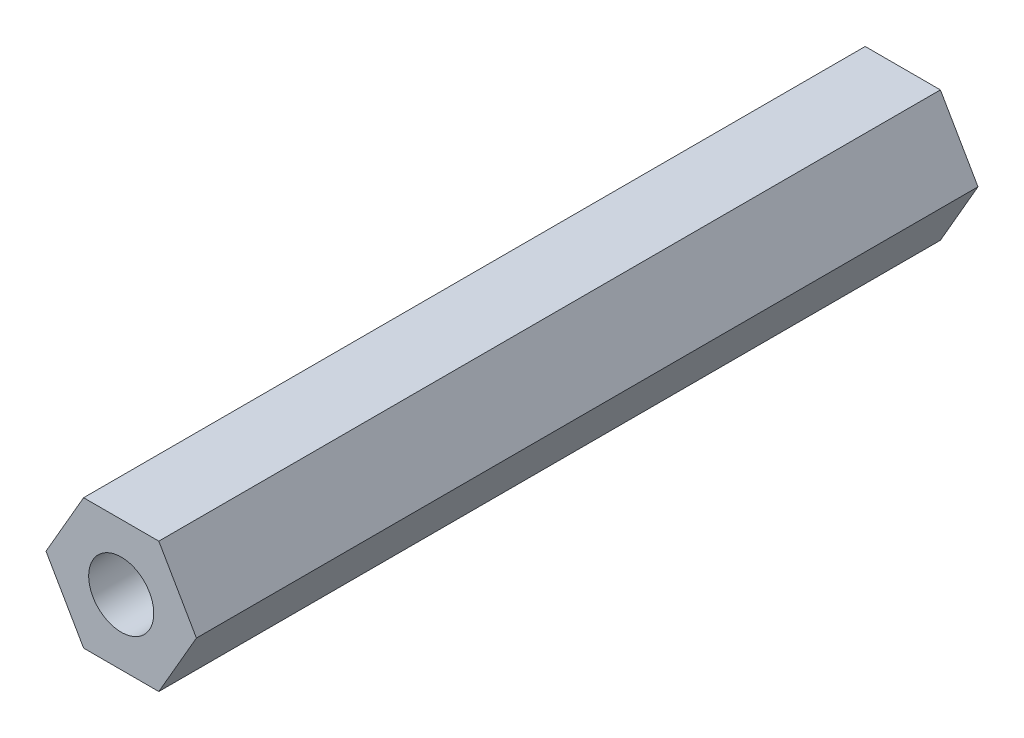
ISO-10303-21;
HEADER;
FILE_DESCRIPTION(('STEP AP214'),'2;1');
FILE_NAME('part.step','',(''),(''),'','','');
FILE_SCHEMA(('AUTOMOTIVE_DESIGN { 1 0 10303 214 1 1 1 1 }'));
ENDSEC;
DATA;
#1=APPLICATION_CONTEXT('core data for automotive mechanical design processes');
#2=APPLICATION_PROTOCOL_DEFINITION('international standard','automotive_design',2000,#1);
#3=PRODUCT_CONTEXT('',#1,'mechanical');
#4=PRODUCT('Part','Part','',(#3));
#5=PRODUCT_RELATED_PRODUCT_CATEGORY('part','',(#4));
#6=PRODUCT_DEFINITION_FORMATION('','',#4);
#7=PRODUCT_DEFINITION_CONTEXT('part definition',#1,'design');
#8=PRODUCT_DEFINITION('design','',#6,#7);
#9=PRODUCT_DEFINITION_SHAPE('','',#8);
#10=(LENGTH_UNIT() NAMED_UNIT(*) SI_UNIT(.MILLI.,.METRE.));
#11=(NAMED_UNIT(*) PLANE_ANGLE_UNIT() SI_UNIT($,.RADIAN.));
#12=(NAMED_UNIT(*) SI_UNIT($,.STERADIAN.) SOLID_ANGLE_UNIT());
#13=UNCERTAINTY_MEASURE_WITH_UNIT(LENGTH_MEASURE(1.E-05),#10,'distance_accuracy_value','');
#14=(GEOMETRIC_REPRESENTATION_CONTEXT(3) GLOBAL_UNCERTAINTY_ASSIGNED_CONTEXT((#13)) GLOBAL_UNIT_ASSIGNED_CONTEXT((#10,
#11,#12)) REPRESENTATION_CONTEXT('',''));
#15=CARTESIAN_POINT('',(0.,0.,0.));
#16=DIRECTION('',(0.,0.,1.));
#17=DIRECTION('',(1.,0.,0.));
#18=AXIS2_PLACEMENT_3D('',#15,#16,#17);
#19=CARTESIAN_POINT('',(0.,0.,76.2));
#20=DIRECTION('',(0.,0.,1.));
#21=DIRECTION('',(1.,0.,0.));
#22=AXIS2_PLACEMENT_3D('',#19,#20,#21);
#23=PLANE('',#22);
#24=DIRECTION('',(-0.5,0.866025403784439,0.));
#25=VECTOR('',#24,1.);
#26=CARTESIAN_POINT('',(7.33234841870825,0.,76.2));
#27=LINE('',#26,#25);
#28=CARTESIAN_POINT('',(7.33234841870825,0.,76.2));
#29=VERTEX_POINT('',#28);
#30=CARTESIAN_POINT('',(3.66617420935413,6.35,76.2));
#31=VERTEX_POINT('',#30);
#32=EDGE_CURVE('E146',#29,#31,#27,.T.);
#33=ORIENTED_EDGE('',*,*,#32,.T.);
#34=DIRECTION('',(-1.,0.,0.));
#35=VECTOR('',#34,1.);
#36=CARTESIAN_POINT('',(3.66617420935413,6.35,76.2));
#37=LINE('',#36,#35);
#38=CARTESIAN_POINT('',(-3.66617420935412,6.35,76.2));
#39=VERTEX_POINT('',#38);
#40=EDGE_CURVE('E94',#31,#39,#37,.T.);
#41=ORIENTED_EDGE('',*,*,#40,.T.);
#42=DIRECTION('',(-0.5,-0.866025403784438,0.));
#43=VECTOR('',#42,1.);
#44=CARTESIAN_POINT('',(-3.66617420935412,6.35,76.2));
#45=LINE('',#44,#43);
#46=CARTESIAN_POINT('',(-7.33234841870825,0.,76.2));
#47=VERTEX_POINT('',#46);
#48=EDGE_CURVE('E107',#39,#47,#45,.T.);
#49=ORIENTED_EDGE('',*,*,#48,.T.);
#50=DIRECTION('',(0.5,-0.866025403784439,0.));
#51=VECTOR('',#50,1.);
#52=CARTESIAN_POINT('',(-7.33234841870825,0.,76.2));
#53=LINE('',#52,#51);
#54=CARTESIAN_POINT('',(-3.66617420935413,-6.35,76.2));
#55=VERTEX_POINT('',#54);
#56=EDGE_CURVE('E101',#47,#55,#53,.T.);
#57=ORIENTED_EDGE('',*,*,#56,.T.);
#58=DIRECTION('',(1.,0.,0.));
#59=VECTOR('',#58,1.);
#60=CARTESIAN_POINT('',(-3.66617420935413,-6.35,76.2));
#61=LINE('',#60,#59);
#62=CARTESIAN_POINT('',(3.66617420935412,-6.35,76.2));
#63=VERTEX_POINT('',#62);
#64=EDGE_CURVE('E105',#55,#63,#61,.T.);
#65=ORIENTED_EDGE('',*,*,#64,.T.);
#66=DIRECTION('',(0.5,0.866025403784438,0.));
#67=VECTOR('',#66,1.);
#68=CARTESIAN_POINT('',(3.66617420935412,-6.35,76.2));
#69=LINE('',#68,#67);
#70=EDGE_CURVE('E57',#63,#29,#69,.T.);
#71=ORIENTED_EDGE('',*,*,#70,.T.);
#72=EDGE_LOOP('',(#33,#41,#49,#57,#65,#71));
#73=FACE_BOUND('',#72,.T.);
#74=CARTESIAN_POINT('',(0.,0.,76.2));
#75=DIRECTION('',(0.,0.,1.));
#76=DIRECTION('',(1.,0.,0.));
#77=AXIS2_PLACEMENT_3D('',#74,#75,#76);
#78=CIRCLE('',#77,3.175);
#79=CARTESIAN_POINT('',(-3.175,0.,76.2));
#80=VERTEX_POINT('',#79);
#81=EDGE_CURVE('E134',#80,#80,#78,.T.);
#82=ORIENTED_EDGE('',*,*,#81,.F.);
#83=EDGE_LOOP('',(#82));
#84=FACE_BOUND('',#83,.T.);
#85=ADVANCED_FACE('F39',(#73,#84),#23,.T.);
#86=CARTESIAN_POINT('',(0.,0.,0.));
#87=DIRECTION('',(0.,0.,1.));
#88=DIRECTION('',(1.,0.,0.));
#89=AXIS2_PLACEMENT_3D('',#86,#87,#88);
#90=PLANE('',#89);
#91=DIRECTION('',(-0.5,0.866025403784439,0.));
#92=VECTOR('',#91,1.);
#93=CARTESIAN_POINT('',(7.33234841870825,0.,0.));
#94=LINE('',#93,#92);
#95=CARTESIAN_POINT('',(7.33234841870825,0.,0.));
#96=VERTEX_POINT('',#95);
#97=CARTESIAN_POINT('',(3.66617420935413,6.35,0.));
#98=VERTEX_POINT('',#97);
#99=EDGE_CURVE('E129',#96,#98,#94,.T.);
#100=ORIENTED_EDGE('',*,*,#99,.F.);
#101=DIRECTION('',(0.5,0.866025403784438,0.));
#102=VECTOR('',#101,1.);
#103=CARTESIAN_POINT('',(3.66617420935412,-6.35,0.));
#104=LINE('',#103,#102);
#105=CARTESIAN_POINT('',(3.66617420935412,-6.35,0.));
#106=VERTEX_POINT('',#105);
#107=EDGE_CURVE('E86',#106,#96,#104,.T.);
#108=ORIENTED_EDGE('',*,*,#107,.F.);
#109=DIRECTION('',(1.,0.,0.));
#110=VECTOR('',#109,1.);
#111=CARTESIAN_POINT('',(-3.66617420935413,-6.35,0.));
#112=LINE('',#111,#110);
#113=CARTESIAN_POINT('',(-3.66617420935413,-6.35,0.));
#114=VERTEX_POINT('',#113);
#115=EDGE_CURVE('E80',#114,#106,#112,.T.);
#116=ORIENTED_EDGE('',*,*,#115,.F.);
#117=DIRECTION('',(0.5,-0.866025403784439,0.));
#118=VECTOR('',#117,1.);
#119=CARTESIAN_POINT('',(-7.33234841870825,0.,0.));
#120=LINE('',#119,#118);
#121=CARTESIAN_POINT('',(-7.33234841870825,0.,0.));
#122=VERTEX_POINT('',#121);
#123=EDGE_CURVE('E116',#122,#114,#120,.T.);
#124=ORIENTED_EDGE('',*,*,#123,.F.);
#125=DIRECTION('',(-0.5,-0.866025403784438,0.));
#126=VECTOR('',#125,1.);
#127=CARTESIAN_POINT('',(-3.66617420935412,6.35,0.));
#128=LINE('',#127,#126);
#129=CARTESIAN_POINT('',(-3.66617420935412,6.35,0.));
#130=VERTEX_POINT('',#129);
#131=EDGE_CURVE('E137',#130,#122,#128,.T.);
#132=ORIENTED_EDGE('',*,*,#131,.F.);
#133=DIRECTION('',(-1.,0.,0.));
#134=VECTOR('',#133,1.);
#135=CARTESIAN_POINT('',(3.66617420935413,6.35,0.));
#136=LINE('',#135,#134);
#137=EDGE_CURVE('E133',#98,#130,#136,.T.);
#138=ORIENTED_EDGE('',*,*,#137,.F.);
#139=EDGE_LOOP('',(#100,#108,#116,#124,#132,#138));
#140=FACE_BOUND('',#139,.T.);
#141=CARTESIAN_POINT('',(0.,0.,0.));
#142=DIRECTION('',(0.,0.,1.));
#143=DIRECTION('',(1.,0.,0.));
#144=AXIS2_PLACEMENT_3D('',#141,#142,#143);
#145=CIRCLE('',#144,3.175);
#146=CARTESIAN_POINT('',(-3.175,0.,0.));
#147=VERTEX_POINT('',#146);
#148=EDGE_CURVE('E243',#147,#147,#145,.T.);
#149=ORIENTED_EDGE('',*,*,#148,.T.);
#150=EDGE_LOOP('',(#149));
#151=FACE_BOUND('',#150,.T.);
#152=ADVANCED_FACE('F159',(#140,#151),#90,.F.);
#153=CARTESIAN_POINT('',(7.33234841870825,0.,76.2));
#154=DIRECTION('',(-0.866025403784439,-0.5,0.));
#155=DIRECTION('',(0.5,-0.866025403784439,0.));
#156=AXIS2_PLACEMENT_3D('',#153,#154,#155);
#157=PLANE('',#156);
#158=ORIENTED_EDGE('',*,*,#99,.T.);
#159=DIRECTION('',(0.,0.,-1.));
#160=VECTOR('',#159,1.);
#161=CARTESIAN_POINT('',(3.66617420935413,6.35,76.2));
#162=LINE('',#161,#160);
#163=EDGE_CURVE('E11',#31,#98,#162,.T.);
#164=ORIENTED_EDGE('',*,*,#163,.F.);
#165=ORIENTED_EDGE('',*,*,#32,.F.);
#166=DIRECTION('',(0.,0.,-1.));
#167=VECTOR('',#166,1.);
#168=CARTESIAN_POINT('',(7.33234841870825,0.,76.2));
#169=LINE('',#168,#167);
#170=EDGE_CURVE('E125',#29,#96,#169,.T.);
#171=ORIENTED_EDGE('',*,*,#170,.T.);
#172=EDGE_LOOP('',(#158,#164,#165,#171));
#173=FACE_BOUND('',#172,.T.);
#174=ADVANCED_FACE('F41',(#173),#157,.F.);
#175=CARTESIAN_POINT('',(3.66617420935413,6.35,76.2));
#176=DIRECTION('',(0.,-1.,0.));
#177=DIRECTION('',(1.,0.,0.));
#178=AXIS2_PLACEMENT_3D('',#175,#176,#177);
#179=PLANE('',#178);
#180=ORIENTED_EDGE('',*,*,#137,.T.);
#181=DIRECTION('',(0.,0.,-1.));
#182=VECTOR('',#181,1.);
#183=CARTESIAN_POINT('',(-3.66617420935412,6.35,76.2));
#184=LINE('',#183,#182);
#185=EDGE_CURVE('E49',#39,#130,#184,.T.);
#186=ORIENTED_EDGE('',*,*,#185,.F.);
#187=ORIENTED_EDGE('',*,*,#40,.F.);
#188=ORIENTED_EDGE('',*,*,#163,.T.);
#189=EDGE_LOOP('',(#180,#186,#187,#188));
#190=FACE_BOUND('',#189,.T.);
#191=ADVANCED_FACE('F184',(#190),#179,.F.);
#192=CARTESIAN_POINT('',(-3.66617420935412,6.35,76.2));
#193=DIRECTION('',(0.866025403784439,-0.5,0.));
#194=DIRECTION('',(0.5,0.866025403784438,0.));
#195=AXIS2_PLACEMENT_3D('',#192,#193,#194);
#196=PLANE('',#195);
#197=ORIENTED_EDGE('',*,*,#131,.T.);
#198=DIRECTION('',(0.,0.,-1.));
#199=VECTOR('',#198,1.);
#200=CARTESIAN_POINT('',(-7.33234841870825,0.,76.2));
#201=LINE('',#200,#199);
#202=EDGE_CURVE('E118',#47,#122,#201,.T.);
#203=ORIENTED_EDGE('',*,*,#202,.F.);
#204=ORIENTED_EDGE('',*,*,#48,.F.);
#205=ORIENTED_EDGE('',*,*,#185,.T.);
#206=EDGE_LOOP('',(#197,#203,#204,#205));
#207=FACE_BOUND('',#206,.T.);
#208=ADVANCED_FACE('F156',(#207),#196,.F.);
#209=CARTESIAN_POINT('',(-7.33234841870825,0.,76.2));
#210=DIRECTION('',(0.866025403784439,0.5,0.));
#211=DIRECTION('',(-0.5,0.866025403784439,0.));
#212=AXIS2_PLACEMENT_3D('',#209,#210,#211);
#213=PLANE('',#212);
#214=ORIENTED_EDGE('',*,*,#123,.T.);
#215=DIRECTION('',(0.,0.,-1.));
#216=VECTOR('',#215,1.);
#217=CARTESIAN_POINT('',(-3.66617420935413,-6.35,76.2));
#218=LINE('',#217,#216);
#219=EDGE_CURVE('E113',#55,#114,#218,.T.);
#220=ORIENTED_EDGE('',*,*,#219,.F.);
#221=ORIENTED_EDGE('',*,*,#56,.F.);
#222=ORIENTED_EDGE('',*,*,#202,.T.);
#223=EDGE_LOOP('',(#214,#220,#221,#222));
#224=FACE_BOUND('',#223,.T.);
#225=ADVANCED_FACE('F114',(#224),#213,.F.);
#226=CARTESIAN_POINT('',(-3.66617420935413,-6.35,76.2));
#227=DIRECTION('',(0.,1.,0.));
#228=DIRECTION('',(-1.,0.,0.));
#229=AXIS2_PLACEMENT_3D('',#226,#227,#228);
#230=PLANE('',#229);
#231=ORIENTED_EDGE('',*,*,#115,.T.);
#232=DIRECTION('',(0.,0.,-1.));
#233=VECTOR('',#232,1.);
#234=CARTESIAN_POINT('',(3.66617420935412,-6.35,76.2));
#235=LINE('',#234,#233);
#236=EDGE_CURVE('E119',#63,#106,#235,.T.);
#237=ORIENTED_EDGE('',*,*,#236,.F.);
#238=ORIENTED_EDGE('',*,*,#64,.F.);
#239=ORIENTED_EDGE('',*,*,#219,.T.);
#240=EDGE_LOOP('',(#231,#237,#238,#239));
#241=FACE_BOUND('',#240,.T.);
#242=ADVANCED_FACE('F121',(#241),#230,.F.);
#243=CARTESIAN_POINT('',(3.66617420935412,-6.35,76.2));
#244=DIRECTION('',(-0.866025403784438,0.5,0.));
#245=DIRECTION('',(-0.5,-0.866025403784438,0.));
#246=AXIS2_PLACEMENT_3D('',#243,#244,#245);
#247=PLANE('',#246);
#248=ORIENTED_EDGE('',*,*,#107,.T.);
#249=ORIENTED_EDGE('',*,*,#170,.F.);
#250=ORIENTED_EDGE('',*,*,#70,.F.);
#251=ORIENTED_EDGE('',*,*,#236,.T.);
#252=EDGE_LOOP('',(#248,#249,#250,#251));
#253=FACE_BOUND('',#252,.T.);
#254=ADVANCED_FACE('F164',(#253),#247,.F.);
#255=CARTESIAN_POINT('',(0.,0.,76.2));
#256=DIRECTION('',(0.,0.,-1.));
#257=DIRECTION('',(-1.,0.,0.));
#258=AXIS2_PLACEMENT_3D('',#255,#256,#257);
#259=CYLINDRICAL_SURFACE('',#258,3.175);
#260=CARTESIAN_POINT('',(-3.175,0.,76.2));
#261=CARTESIAN_POINT('',(-3.175,0.,75.40625));
#262=CARTESIAN_POINT('',(-3.175,0.,74.6125));
#263=CARTESIAN_POINT('',(-3.175,0.,73.025));
#264=CARTESIAN_POINT('',(-3.175,0.,72.23125));
#265=CARTESIAN_POINT('',(-3.175,0.,70.64375));
#266=CARTESIAN_POINT('',(-3.175,0.,69.85));
#267=CARTESIAN_POINT('',(-3.175,0.,68.2625));
#268=CARTESIAN_POINT('',(-3.175,0.,67.46875));
#269=CARTESIAN_POINT('',(-3.175,0.,65.88125));
#270=CARTESIAN_POINT('',(-3.175,0.,65.0875));
#271=CARTESIAN_POINT('',(-3.175,0.,63.5));
#272=CARTESIAN_POINT('',(-3.175,0.,62.70625));
#273=CARTESIAN_POINT('',(-3.175,0.,61.11875));
#274=CARTESIAN_POINT('',(-3.175,0.,60.325));
#275=CARTESIAN_POINT('',(-3.175,0.,58.7375));
#276=CARTESIAN_POINT('',(-3.175,0.,57.94375));
#277=CARTESIAN_POINT('',(-3.175,0.,56.35625));
#278=CARTESIAN_POINT('',(-3.175,0.,55.5625));
#279=CARTESIAN_POINT('',(-3.175,0.,53.975));
#280=CARTESIAN_POINT('',(-3.175,0.,53.18125));
#281=CARTESIAN_POINT('',(-3.175,0.,51.59375));
#282=CARTESIAN_POINT('',(-3.175,0.,50.8));
#283=CARTESIAN_POINT('',(-3.175,0.,49.2125));
#284=CARTESIAN_POINT('',(-3.175,0.,48.41875));
#285=CARTESIAN_POINT('',(-3.175,0.,46.83125));
#286=CARTESIAN_POINT('',(-3.175,0.,46.0375));
#287=CARTESIAN_POINT('',(-3.175,0.,44.45));
#288=CARTESIAN_POINT('',(-3.175,0.,43.65625));
#289=CARTESIAN_POINT('',(-3.175,0.,42.06875));
#290=CARTESIAN_POINT('',(-3.175,0.,41.275));
#291=CARTESIAN_POINT('',(-3.175,0.,39.6875));
#292=CARTESIAN_POINT('',(-3.175,0.,38.89375));
#293=CARTESIAN_POINT('',(-3.175,0.,37.30625));
#294=CARTESIAN_POINT('',(-3.175,0.,36.5125));
#295=CARTESIAN_POINT('',(-3.175,0.,34.925));
#296=CARTESIAN_POINT('',(-3.175,0.,34.13125));
#297=CARTESIAN_POINT('',(-3.175,0.,32.54375));
#298=CARTESIAN_POINT('',(-3.175,0.,31.75));
#299=CARTESIAN_POINT('',(-3.175,0.,30.1625));
#300=CARTESIAN_POINT('',(-3.175,0.,29.36875));
#301=CARTESIAN_POINT('',(-3.175,0.,27.78125));
#302=CARTESIAN_POINT('',(-3.175,0.,26.9875));
#303=CARTESIAN_POINT('',(-3.175,0.,25.4));
#304=CARTESIAN_POINT('',(-3.175,0.,24.60625));
#305=CARTESIAN_POINT('',(-3.175,0.,23.01875));
#306=CARTESIAN_POINT('',(-3.175,0.,22.225));
#307=CARTESIAN_POINT('',(-3.175,0.,20.6375));
#308=CARTESIAN_POINT('',(-3.175,0.,19.84375));
#309=CARTESIAN_POINT('',(-3.175,0.,18.25625));
#310=CARTESIAN_POINT('',(-3.175,0.,17.4625));
#311=CARTESIAN_POINT('',(-3.175,0.,15.875));
#312=CARTESIAN_POINT('',(-3.175,0.,15.08125));
#313=CARTESIAN_POINT('',(-3.175,0.,13.49375));
#314=CARTESIAN_POINT('',(-3.175,0.,12.7));
#315=CARTESIAN_POINT('',(-3.175,0.,11.1125));
#316=CARTESIAN_POINT('',(-3.175,0.,10.31875));
#317=CARTESIAN_POINT('',(-3.175,0.,8.73125));
#318=CARTESIAN_POINT('',(-3.175,0.,7.93750000000001));
#319=CARTESIAN_POINT('',(-3.175,0.,6.35));
#320=CARTESIAN_POINT('',(-3.175,0.,5.55625));
#321=CARTESIAN_POINT('',(-3.175,0.,3.96875));
#322=CARTESIAN_POINT('',(-3.175,0.,3.175));
#323=CARTESIAN_POINT('',(-3.175,0.,1.5875));
#324=CARTESIAN_POINT('',(-3.175,0.,0.793750000000001));
#325=CARTESIAN_POINT('',(-3.175,0.,0.));
#326=B_SPLINE_CURVE_WITH_KNOTS('',3,(#260,#261,#262,#263,#264,#265,#266,#267,#268,#269,#270,
#271,#272,#273,#274,#275,#276,#277,#278,#279,#280,#281,#282,#283,#284,#285,#286,#287,#288,#289,
#290,#291,#292,#293,#294,#295,#296,#297,#298,#299,#300,#301,#302,#303,#304,#305,#306,#307,#308,
#309,#310,#311,#312,#313,#314,#315,#316,#317,#318,#319,#320,#321,#322,#323,#324,#325),
.UNSPECIFIED.,.F.,.F.,(4,2,2,2,2,2,2,2,2,2,2,2,2,2,2,2,2,2,2,2,2,2,2,2,2,2,2,2,2,2,2,2,4),(0.,
2.38125,4.7625,7.14375,9.52500000000001,11.90625,14.2875,16.66875,19.05,21.43125,23.8125,
26.19375,28.575,30.95625,33.3375,35.71875,38.1,40.48125,42.8625,45.24375,47.625,50.00625,
52.3875,54.76875,57.15,59.53125,61.9125,64.29375,66.675,69.05625,71.4375,73.81875,76.2),.UNSPECIFIED.);
#327=EDGE_CURVE('BSEAM166',#80,#147,#326,.T.);
#328=ORIENTED_EDGE('',*,*,#81,.T.);
#329=ORIENTED_EDGE('',*,*,#148,.F.);
#330=ORIENTED_EDGE('',*,*,#327,.T.);
#331=ORIENTED_EDGE('',*,*,#327,.F.);
#332=EDGE_LOOP('',(#328,#330,#329,#331));
#333=FACE_BOUND('',#332,.T.);
#334=ADVANCED_FACE('F166',(#333),#259,.F.);
#335=CLOSED_SHELL('',(#85,#152,#174,#191,#208,#225,#242,#254,#334));
#336=MANIFOLD_SOLID_BREP('B2',#335);
#337=ADVANCED_BREP_SHAPE_REPRESENTATION('',(#18,#336),#14);
#338=SHAPE_DEFINITION_REPRESENTATION(#9,#337);
ENDSEC;
END-ISO-10303-21;
